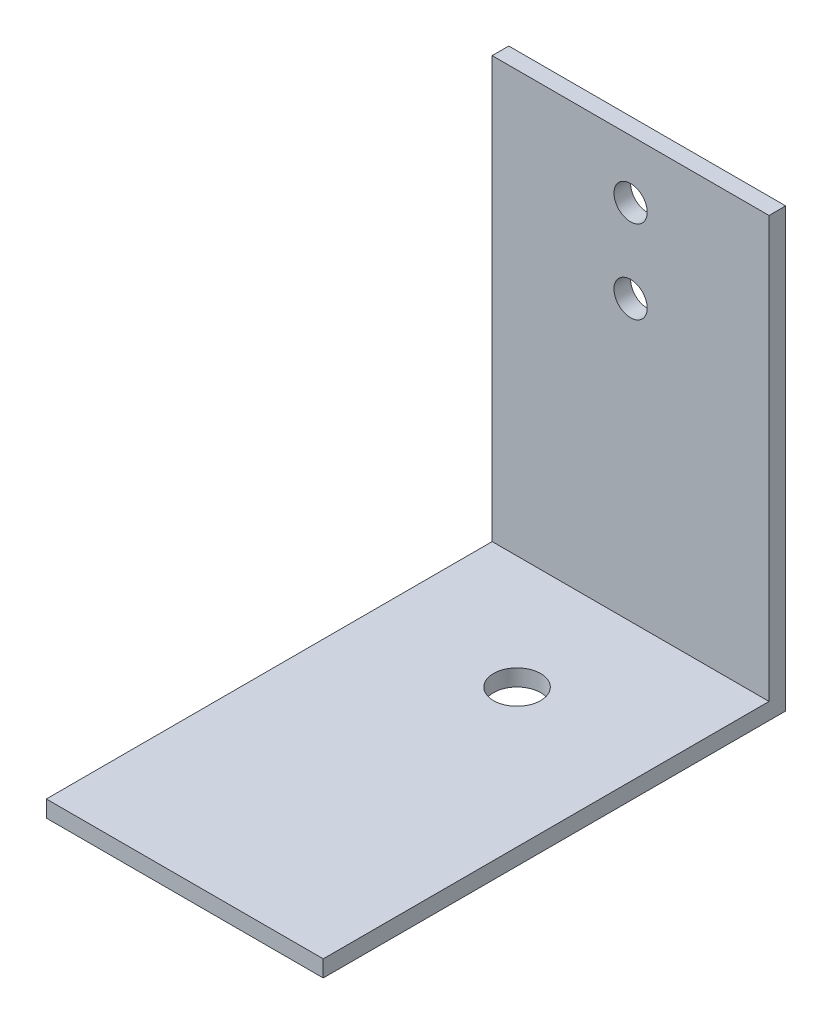
ISO-10303-21;
HEADER;
FILE_DESCRIPTION(('STEP AP214'),'2;1');
FILE_NAME('part.step','',(''),(''),'','','');
FILE_SCHEMA(('AUTOMOTIVE_DESIGN { 1 0 10303 214 1 1 1 1 }'));
ENDSEC;
DATA;
#1=APPLICATION_CONTEXT('core data for automotive mechanical design processes');
#2=APPLICATION_PROTOCOL_DEFINITION('international standard','automotive_design',2000,#1);
#3=PRODUCT_CONTEXT('',#1,'mechanical');
#4=PRODUCT('Part','Part','',(#3));
#5=PRODUCT_RELATED_PRODUCT_CATEGORY('part','',(#4));
#6=PRODUCT_DEFINITION_FORMATION('','',#4);
#7=PRODUCT_DEFINITION_CONTEXT('part definition',#1,'design');
#8=PRODUCT_DEFINITION('design','',#6,#7);
#9=PRODUCT_DEFINITION_SHAPE('','',#8);
#10=(LENGTH_UNIT() NAMED_UNIT(*) SI_UNIT(.MILLI.,.METRE.));
#11=(NAMED_UNIT(*) PLANE_ANGLE_UNIT() SI_UNIT($,.RADIAN.));
#12=(NAMED_UNIT(*) SI_UNIT($,.STERADIAN.) SOLID_ANGLE_UNIT());
#13=UNCERTAINTY_MEASURE_WITH_UNIT(LENGTH_MEASURE(1.E-05),#10,'distance_accuracy_value','');
#14=(GEOMETRIC_REPRESENTATION_CONTEXT(3) GLOBAL_UNCERTAINTY_ASSIGNED_CONTEXT((#13)) GLOBAL_UNIT_ASSIGNED_CONTEXT((#10,
#11,#12)) REPRESENTATION_CONTEXT('',''));
#15=CARTESIAN_POINT('',(0.,0.,0.));
#16=DIRECTION('',(0.,0.,1.));
#17=DIRECTION('',(1.,0.,0.));
#18=AXIS2_PLACEMENT_3D('',#15,#16,#17);
#19=CARTESIAN_POINT('',(-50.,39.5,3.));
#20=DIRECTION('',(0.,1.,0.));
#21=DIRECTION('',(0.,0.,1.));
#22=AXIS2_PLACEMENT_3D('',#19,#20,#21);
#23=PLANE('',#22);
#24=DIRECTION('',(0.,0.,1.));
#25=VECTOR('',#24,1.);
#26=CARTESIAN_POINT('',(0.,39.5,3.));
#27=LINE('',#26,#25);
#28=CARTESIAN_POINT('',(0.,39.5,0.));
#29=VERTEX_POINT('',#28);
#30=CARTESIAN_POINT('',(0.,39.5,3.));
#31=VERTEX_POINT('',#30);
#32=EDGE_CURVE('E136',#29,#31,#27,.T.);
#33=ORIENTED_EDGE('',*,*,#32,.F.);
#34=DIRECTION('',(1.,0.,0.));
#35=VECTOR('',#34,1.);
#36=CARTESIAN_POINT('',(-50.,39.5,0.));
#37=LINE('',#36,#35);
#38=CARTESIAN_POINT('',(-50.,39.5,0.));
#39=VERTEX_POINT('',#38);
#40=EDGE_CURVE('E11',#39,#29,#37,.T.);
#41=ORIENTED_EDGE('',*,*,#40,.F.);
#42=DIRECTION('',(0.,0.,1.));
#43=VECTOR('',#42,1.);
#44=CARTESIAN_POINT('',(-50.,39.5,3.));
#45=LINE('',#44,#43);
#46=CARTESIAN_POINT('',(-50.,39.5,3.));
#47=VERTEX_POINT('',#46);
#48=EDGE_CURVE('E157',#39,#47,#45,.T.);
#49=ORIENTED_EDGE('',*,*,#48,.T.);
#50=DIRECTION('',(1.,0.,0.));
#51=VECTOR('',#50,1.);
#52=CARTESIAN_POINT('',(-50.,39.5,3.));
#53=LINE('',#52,#51);
#54=EDGE_CURVE('E48',#47,#31,#53,.T.);
#55=ORIENTED_EDGE('',*,*,#54,.T.);
#56=EDGE_LOOP('',(#33,#41,#49,#55));
#57=FACE_BOUND('',#56,.T.);
#58=ADVANCED_FACE('F45',(#57),#23,.T.);
#59=CARTESIAN_POINT('',(-50.,39.5,0.));
#60=DIRECTION('',(0.,0.,-1.));
#61=DIRECTION('',(0.,1.,0.));
#62=AXIS2_PLACEMENT_3D('',#59,#60,#61);
#63=PLANE('',#62);
#64=CARTESIAN_POINT('',(-25.,29.,0.));
#65=DIRECTION('',(0.,0.,-1.));
#66=DIRECTION('',(0.,1.,0.));
#67=AXIS2_PLACEMENT_3D('',#64,#65,#66);
#68=CIRCLE('',#67,3.);
#69=CARTESIAN_POINT('',(-25.,32.,0.));
#70=VERTEX_POINT('',#69);
#71=EDGE_CURVE('E141',#70,#70,#68,.F.);
#72=ORIENTED_EDGE('',*,*,#71,.T.);
#73=EDGE_LOOP('',(#72));
#74=FACE_BOUND('',#73,.T.);
#75=CARTESIAN_POINT('',(-25.,14.,0.));
#76=DIRECTION('',(0.,0.,-1.));
#77=DIRECTION('',(0.,1.,0.));
#78=AXIS2_PLACEMENT_3D('',#75,#76,#77);
#79=CIRCLE('',#78,3.);
#80=CARTESIAN_POINT('',(-25.,17.,0.));
#81=VERTEX_POINT('',#80);
#82=EDGE_CURVE('E205',#81,#81,#79,.F.);
#83=ORIENTED_EDGE('',*,*,#82,.T.);
#84=EDGE_LOOP('',(#83));
#85=FACE_BOUND('',#84,.T.);
#86=DIRECTION('',(0.,1.,0.));
#87=VECTOR('',#86,1.);
#88=CARTESIAN_POINT('',(0.,39.5,0.));
#89=LINE('',#88,#87);
#90=CARTESIAN_POINT('',(0.,-39.5,0.));
#91=VERTEX_POINT('',#90);
#92=EDGE_CURVE('E154',#91,#29,#89,.T.);
#93=ORIENTED_EDGE('',*,*,#92,.F.);
#94=DIRECTION('',(1.,0.,0.));
#95=VECTOR('',#94,1.);
#96=CARTESIAN_POINT('',(-50.,-39.5,0.));
#97=LINE('',#96,#95);
#98=CARTESIAN_POINT('',(-50.,-39.5,0.));
#99=VERTEX_POINT('',#98);
#100=EDGE_CURVE('E55',#99,#91,#97,.T.);
#101=ORIENTED_EDGE('',*,*,#100,.F.);
#102=DIRECTION('',(0.,1.,0.));
#103=VECTOR('',#102,1.);
#104=CARTESIAN_POINT('',(-50.,39.5,0.));
#105=LINE('',#104,#103);
#106=EDGE_CURVE('E122',#99,#39,#105,.T.);
#107=ORIENTED_EDGE('',*,*,#106,.T.);
#108=ORIENTED_EDGE('',*,*,#40,.T.);
#109=EDGE_LOOP('',(#93,#101,#107,#108));
#110=FACE_BOUND('',#109,.T.);
#111=ADVANCED_FACE('F169',(#74,#85,#110),#63,.T.);
#112=CARTESIAN_POINT('',(-50.,-39.5,0.));
#113=DIRECTION('',(0.,-1.,0.));
#114=DIRECTION('',(0.,0.,-1.));
#115=AXIS2_PLACEMENT_3D('',#112,#113,#114);
#116=PLANE('',#115);
#117=CARTESIAN_POINT('',(-25.,-39.5,23.5));
#118=DIRECTION('',(0.,-1.,0.));
#119=DIRECTION('',(0.,0.,-1.));
#120=AXIS2_PLACEMENT_3D('',#117,#118,#119);
#121=CIRCLE('',#120,4.25);
#122=CARTESIAN_POINT('',(-25.,-39.5,19.25));
#123=VERTEX_POINT('',#122);
#124=EDGE_CURVE('E211',#123,#123,#121,.F.);
#125=ORIENTED_EDGE('',*,*,#124,.T.);
#126=EDGE_LOOP('',(#125));
#127=FACE_BOUND('',#126,.T.);
#128=DIRECTION('',(0.,0.,-1.));
#129=VECTOR('',#128,1.);
#130=CARTESIAN_POINT('',(0.,-39.5,0.));
#131=LINE('',#130,#129);
#132=CARTESIAN_POINT('',(0.,-39.5,83.5));
#133=VERTEX_POINT('',#132);
#134=EDGE_CURVE('E108',#133,#91,#131,.T.);
#135=ORIENTED_EDGE('',*,*,#134,.F.);
#136=DIRECTION('',(1.,0.,0.));
#137=VECTOR('',#136,1.);
#138=CARTESIAN_POINT('',(-50.,-39.5,83.5));
#139=LINE('',#138,#137);
#140=CARTESIAN_POINT('',(-50.,-39.5,83.5));
#141=VERTEX_POINT('',#140);
#142=EDGE_CURVE('E103',#141,#133,#139,.T.);
#143=ORIENTED_EDGE('',*,*,#142,.F.);
#144=DIRECTION('',(0.,0.,-1.));
#145=VECTOR('',#144,1.);
#146=CARTESIAN_POINT('',(-50.,-39.5,0.));
#147=LINE('',#146,#145);
#148=EDGE_CURVE('E106',#141,#99,#147,.T.);
#149=ORIENTED_EDGE('',*,*,#148,.T.);
#150=ORIENTED_EDGE('',*,*,#100,.T.);
#151=EDGE_LOOP('',(#135,#143,#149,#150));
#152=FACE_BOUND('',#151,.T.);
#153=ADVANCED_FACE('F105',(#127,#152),#116,.T.);
#154=CARTESIAN_POINT('',(-50.,-39.5,83.5));
#155=DIRECTION('',(0.,0.,1.));
#156=DIRECTION('',(1.,0.,0.));
#157=AXIS2_PLACEMENT_3D('',#154,#155,#156);
#158=PLANE('',#157);
#159=DIRECTION('',(0.,-1.,0.));
#160=VECTOR('',#159,1.);
#161=CARTESIAN_POINT('',(0.,-39.5,83.5));
#162=LINE('',#161,#160);
#163=CARTESIAN_POINT('',(0.,-36.5,83.5));
#164=VERTEX_POINT('',#163);
#165=EDGE_CURVE('E149',#164,#133,#162,.T.);
#166=ORIENTED_EDGE('',*,*,#165,.F.);
#167=DIRECTION('',(1.,0.,0.));
#168=VECTOR('',#167,1.);
#169=CARTESIAN_POINT('',(-50.,-36.5,83.5));
#170=LINE('',#169,#168);
#171=CARTESIAN_POINT('',(-50.,-36.5,83.5));
#172=VERTEX_POINT('',#171);
#173=EDGE_CURVE('E114',#172,#164,#170,.T.);
#174=ORIENTED_EDGE('',*,*,#173,.F.);
#175=DIRECTION('',(0.,-1.,0.));
#176=VECTOR('',#175,1.);
#177=CARTESIAN_POINT('',(-50.,-39.5,83.5));
#178=LINE('',#177,#176);
#179=EDGE_CURVE('E120',#172,#141,#178,.T.);
#180=ORIENTED_EDGE('',*,*,#179,.T.);
#181=ORIENTED_EDGE('',*,*,#142,.T.);
#182=EDGE_LOOP('',(#166,#174,#180,#181));
#183=FACE_BOUND('',#182,.T.);
#184=ADVANCED_FACE('F125',(#183),#158,.T.);
#185=CARTESIAN_POINT('',(-50.,-36.5,83.5));
#186=DIRECTION('',(0.,1.,0.));
#187=DIRECTION('',(0.,0.,1.));
#188=AXIS2_PLACEMENT_3D('',#185,#186,#187);
#189=PLANE('',#188);
#190=CARTESIAN_POINT('',(-25.,-36.5,23.5));
#191=DIRECTION('',(0.,1.,0.));
#192=DIRECTION('',(0.,0.,1.));
#193=AXIS2_PLACEMENT_3D('',#190,#191,#192);
#194=CIRCLE('',#193,4.25);
#195=CARTESIAN_POINT('',(-25.,-36.5,27.75));
#196=VERTEX_POINT('',#195);
#197=EDGE_CURVE('E224',#196,#196,#194,.T.);
#198=ORIENTED_EDGE('',*,*,#197,.F.);
#199=EDGE_LOOP('',(#198));
#200=FACE_BOUND('',#199,.T.);
#201=DIRECTION('',(0.,0.,1.));
#202=VECTOR('',#201,1.);
#203=CARTESIAN_POINT('',(0.,-36.5,83.5));
#204=LINE('',#203,#202);
#205=CARTESIAN_POINT('',(0.,-36.5,3.));
#206=VERTEX_POINT('',#205);
#207=EDGE_CURVE('E145',#206,#164,#204,.T.);
#208=ORIENTED_EDGE('',*,*,#207,.F.);
#209=DIRECTION('',(1.,0.,0.));
#210=VECTOR('',#209,1.);
#211=CARTESIAN_POINT('',(-50.,-36.5,3.));
#212=LINE('',#211,#210);
#213=CARTESIAN_POINT('',(-50.,-36.5,3.));
#214=VERTEX_POINT('',#213);
#215=EDGE_CURVE('E162',#214,#206,#212,.T.);
#216=ORIENTED_EDGE('',*,*,#215,.F.);
#217=DIRECTION('',(0.,0.,1.));
#218=VECTOR('',#217,1.);
#219=CARTESIAN_POINT('',(-50.,-36.5,83.5));
#220=LINE('',#219,#218);
#221=EDGE_CURVE('E127',#214,#172,#220,.T.);
#222=ORIENTED_EDGE('',*,*,#221,.T.);
#223=ORIENTED_EDGE('',*,*,#173,.T.);
#224=EDGE_LOOP('',(#208,#216,#222,#223));
#225=FACE_BOUND('',#224,.T.);
#226=ADVANCED_FACE('F188',(#200,#225),#189,.T.);
#227=CARTESIAN_POINT('',(-50.,-36.5,3.));
#228=DIRECTION('',(0.,0.,1.));
#229=DIRECTION('',(0.,-1.,0.));
#230=AXIS2_PLACEMENT_3D('',#227,#228,#229);
#231=PLANE('',#230);
#232=CARTESIAN_POINT('',(-25.,29.,3.));
#233=DIRECTION('',(0.,0.,1.));
#234=DIRECTION('',(1.,0.,0.));
#235=AXIS2_PLACEMENT_3D('',#232,#233,#234);
#236=CIRCLE('',#235,3.);
#237=CARTESIAN_POINT('',(-22.,29.,3.));
#238=VERTEX_POINT('',#237);
#239=EDGE_CURVE('E199',#238,#238,#236,.T.);
#240=ORIENTED_EDGE('',*,*,#239,.F.);
#241=EDGE_LOOP('',(#240));
#242=FACE_BOUND('',#241,.T.);
#243=CARTESIAN_POINT('',(-25.,14.,3.));
#244=DIRECTION('',(0.,0.,1.));
#245=DIRECTION('',(1.,0.,0.));
#246=AXIS2_PLACEMENT_3D('',#243,#244,#245);
#247=CIRCLE('',#246,3.);
#248=CARTESIAN_POINT('',(-22.,14.,3.));
#249=VERTEX_POINT('',#248);
#250=EDGE_CURVE('E202',#249,#249,#247,.T.);
#251=ORIENTED_EDGE('',*,*,#250,.F.);
#252=EDGE_LOOP('',(#251));
#253=FACE_BOUND('',#252,.T.);
#254=DIRECTION('',(0.,-1.,0.));
#255=VECTOR('',#254,1.);
#256=CARTESIAN_POINT('',(0.,-36.5,3.));
#257=LINE('',#256,#255);
#258=EDGE_CURVE('E140',#31,#206,#257,.T.);
#259=ORIENTED_EDGE('',*,*,#258,.F.);
#260=ORIENTED_EDGE('',*,*,#54,.F.);
#261=DIRECTION('',(0.,-1.,0.));
#262=VECTOR('',#261,1.);
#263=CARTESIAN_POINT('',(-50.,-36.5,3.));
#264=LINE('',#263,#262);
#265=EDGE_CURVE('E130',#47,#214,#264,.T.);
#266=ORIENTED_EDGE('',*,*,#265,.T.);
#267=ORIENTED_EDGE('',*,*,#215,.T.);
#268=EDGE_LOOP('',(#259,#260,#266,#267));
#269=FACE_BOUND('',#268,.T.);
#270=ADVANCED_FACE('F166',(#242,#253,#269),#231,.T.);
#271=CARTESIAN_POINT('',(-50.,0.,0.));
#272=DIRECTION('',(-1.,0.,0.));
#273=DIRECTION('',(0.,0.,1.));
#274=AXIS2_PLACEMENT_3D('',#271,#272,#273);
#275=PLANE('',#274);
#276=ORIENTED_EDGE('',*,*,#48,.F.);
#277=ORIENTED_EDGE('',*,*,#106,.F.);
#278=ORIENTED_EDGE('',*,*,#148,.F.);
#279=ORIENTED_EDGE('',*,*,#179,.F.);
#280=ORIENTED_EDGE('',*,*,#221,.F.);
#281=ORIENTED_EDGE('',*,*,#265,.F.);
#282=EDGE_LOOP('',(#276,#277,#278,#279,#280,#281));
#283=FACE_BOUND('',#282,.T.);
#284=ADVANCED_FACE('F118',(#283),#275,.T.);
#285=CARTESIAN_POINT('',(0.,0.,0.));
#286=DIRECTION('',(-1.,0.,0.));
#287=DIRECTION('',(0.,0.,1.));
#288=AXIS2_PLACEMENT_3D('',#285,#286,#287);
#289=PLANE('',#288);
#290=ORIENTED_EDGE('',*,*,#32,.T.);
#291=ORIENTED_EDGE('',*,*,#258,.T.);
#292=ORIENTED_EDGE('',*,*,#207,.T.);
#293=ORIENTED_EDGE('',*,*,#165,.T.);
#294=ORIENTED_EDGE('',*,*,#134,.T.);
#295=ORIENTED_EDGE('',*,*,#92,.T.);
#296=EDGE_LOOP('',(#290,#291,#292,#293,#294,#295));
#297=FACE_BOUND('',#296,.T.);
#298=ADVANCED_FACE('F168',(#297),#289,.F.);
#299=CARTESIAN_POINT('',(-25.,14.,-8.48528137423858));
#300=DIRECTION('',(0.,0.,1.));
#301=DIRECTION('',(1.,0.,0.));
#302=AXIS2_PLACEMENT_3D('',#299,#300,#301);
#303=CYLINDRICAL_SURFACE('',#302,3.);
#304=ORIENTED_EDGE('',*,*,#250,.T.);
#305=EDGE_LOOP('',(#304));
#306=FACE_BOUND('',#305,.T.);
#307=ORIENTED_EDGE('',*,*,#82,.F.);
#308=EDGE_LOOP('',(#307));
#309=FACE_BOUND('',#308,.T.);
#310=ADVANCED_FACE('F238',(#306,#309),#303,.F.);
#311=CARTESIAN_POINT('',(-25.,29.,-8.48528137423858));
#312=DIRECTION('',(0.,0.,1.));
#313=DIRECTION('',(1.,0.,0.));
#314=AXIS2_PLACEMENT_3D('',#311,#312,#313);
#315=CYLINDRICAL_SURFACE('',#314,3.);
#316=ORIENTED_EDGE('',*,*,#239,.T.);
#317=EDGE_LOOP('',(#316));
#318=FACE_BOUND('',#317,.T.);
#319=ORIENTED_EDGE('',*,*,#71,.F.);
#320=EDGE_LOOP('',(#319));
#321=FACE_BOUND('',#320,.T.);
#322=ADVANCED_FACE('F232',(#318,#321),#315,.F.);
#323=CARTESIAN_POINT('',(-25.,-51.5208152801713,23.5));
#324=DIRECTION('',(0.,1.,0.));
#325=DIRECTION('',(0.,0.,1.));
#326=AXIS2_PLACEMENT_3D('',#323,#324,#325);
#327=CYLINDRICAL_SURFACE('',#326,4.25);
#328=ORIENTED_EDGE('',*,*,#197,.T.);
#329=EDGE_LOOP('',(#328));
#330=FACE_BOUND('',#329,.T.);
#331=ORIENTED_EDGE('',*,*,#124,.F.);
#332=EDGE_LOOP('',(#331));
#333=FACE_BOUND('',#332,.T.);
#334=ADVANCED_FACE('F229',(#330,#333),#327,.F.);
#335=CLOSED_SHELL('',(#58,#111,#153,#184,#226,#270,#284,#298,#310,#322,#334));
#336=MANIFOLD_SOLID_BREP('B2',#335);
#337=ADVANCED_BREP_SHAPE_REPRESENTATION('',(#18,#336),#14);
#338=SHAPE_DEFINITION_REPRESENTATION(#9,#337);
ENDSEC;
END-ISO-10303-21;
